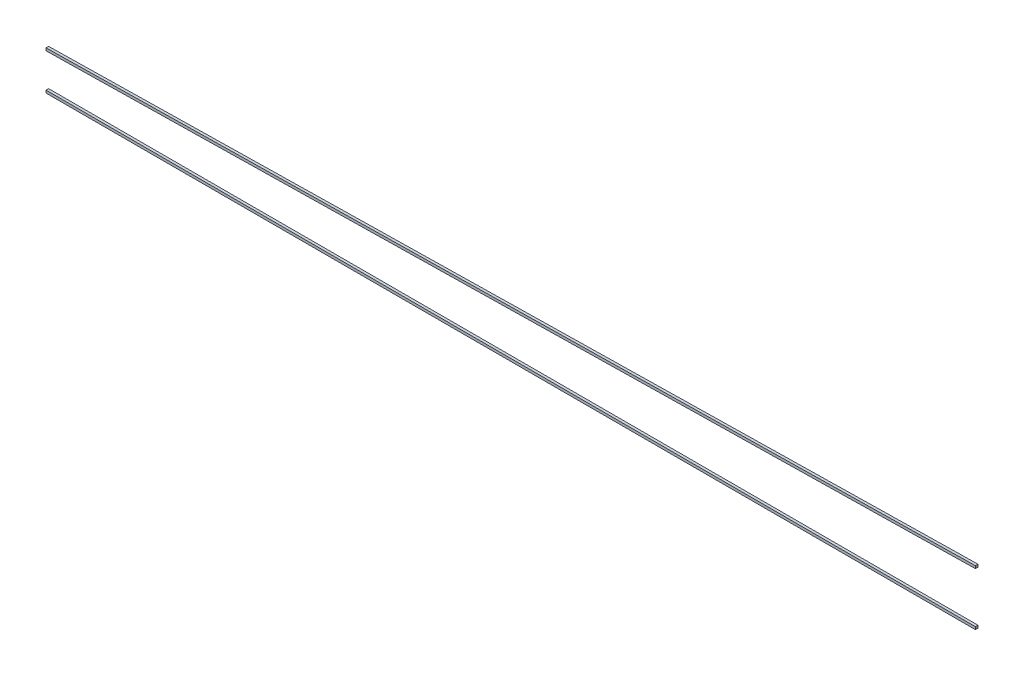
ISO-10303-21;
HEADER;
FILE_DESCRIPTION(('STEP AP214'),'2;1');
FILE_NAME('part.step','',(''),(''),'','','');
FILE_SCHEMA(('AUTOMOTIVE_DESIGN { 1 0 10303 214 1 1 1 1 }'));
ENDSEC;
DATA;
#1=APPLICATION_CONTEXT('core data for automotive mechanical design processes');
#2=APPLICATION_PROTOCOL_DEFINITION('international standard','automotive_design',2000,#1);
#3=PRODUCT_CONTEXT('',#1,'mechanical');
#4=PRODUCT('Part','Part','',(#3));
#5=PRODUCT_RELATED_PRODUCT_CATEGORY('part','',(#4));
#6=PRODUCT_DEFINITION_FORMATION('','',#4);
#7=PRODUCT_DEFINITION_CONTEXT('part definition',#1,'design');
#8=PRODUCT_DEFINITION('design','',#6,#7);
#9=PRODUCT_DEFINITION_SHAPE('','',#8);
#10=(LENGTH_UNIT() NAMED_UNIT(*) SI_UNIT(.MILLI.,.METRE.));
#11=(NAMED_UNIT(*) PLANE_ANGLE_UNIT() SI_UNIT($,.RADIAN.));
#12=(NAMED_UNIT(*) SI_UNIT($,.STERADIAN.) SOLID_ANGLE_UNIT());
#13=UNCERTAINTY_MEASURE_WITH_UNIT(LENGTH_MEASURE(1.E-05),#10,'distance_accuracy_value','');
#14=(GEOMETRIC_REPRESENTATION_CONTEXT(3) GLOBAL_UNCERTAINTY_ASSIGNED_CONTEXT((#13)) GLOBAL_UNIT_ASSIGNED_CONTEXT((#10,
#11,#12)) REPRESENTATION_CONTEXT('',''));
#15=CARTESIAN_POINT('',(0.,0.,0.));
#16=DIRECTION('',(0.,0.,1.));
#17=DIRECTION('',(1.,0.,0.));
#18=AXIS2_PLACEMENT_3D('',#15,#16,#17);
#19=CARTESIAN_POINT('',(271.859441677138,103.463901147709,2.));
#20=DIRECTION('',(1.,0.,0.));
#21=DIRECTION('',(0.,0.,-1.));
#22=AXIS2_PLACEMENT_3D('',#19,#20,#21);
#23=PLANE('',#22);
#24=DIRECTION('',(0.,-1.,0.));
#25=VECTOR('',#24,1.);
#26=CARTESIAN_POINT('',(271.859441677138,103.463901147709,0.));
#27=LINE('',#26,#25);
#28=CARTESIAN_POINT('',(271.859441677138,105.463901147709,0.));
#29=VERTEX_POINT('',#28);
#30=CARTESIAN_POINT('',(271.859441677138,103.463901147709,0.));
#31=VERTEX_POINT('',#30);
#32=EDGE_CURVE('E106',#29,#31,#27,.T.);
#33=ORIENTED_EDGE('',*,*,#32,.T.);
#34=DIRECTION('',(0.,0.,-1.));
#35=VECTOR('',#34,1.);
#36=CARTESIAN_POINT('',(271.859441677138,103.463901147709,2.));
#37=LINE('',#36,#35);
#38=CARTESIAN_POINT('',(271.859441677138,103.463901147709,2.));
#39=VERTEX_POINT('',#38);
#40=EDGE_CURVE('E12',#39,#31,#37,.T.);
#41=ORIENTED_EDGE('',*,*,#40,.F.);
#42=DIRECTION('',(0.,-1.,0.));
#43=VECTOR('',#42,1.);
#44=CARTESIAN_POINT('',(271.859441677138,103.463901147709,2.));
#45=LINE('',#44,#43);
#46=CARTESIAN_POINT('',(271.859441677138,105.463901147709,2.));
#47=VERTEX_POINT('',#46);
#48=EDGE_CURVE('E94',#47,#39,#45,.T.);
#49=ORIENTED_EDGE('',*,*,#48,.F.);
#50=DIRECTION('',(0.,0.,-1.));
#51=VECTOR('',#50,1.);
#52=CARTESIAN_POINT('',(271.859441677138,105.463901147709,2.));
#53=LINE('',#52,#51);
#54=EDGE_CURVE('E102',#47,#29,#53,.T.);
#55=ORIENTED_EDGE('',*,*,#54,.T.);
#56=EDGE_LOOP('',(#33,#41,#49,#55));
#57=FACE_BOUND('',#56,.T.);
#58=ADVANCED_FACE('F43',(#57),#23,.F.);
#59=CARTESIAN_POINT('',(271.859441677138,103.463901147709,2.));
#60=DIRECTION('',(-0.0174524064372835,0.999847695156391,0.));
#61=DIRECTION('',(-0.999847695156391,-0.0174524064372835,0.));
#62=AXIS2_PLACEMENT_3D('',#59,#60,#61);
#63=PLANE('',#62);
#64=DIRECTION('',(0.999847695156391,0.0174524064372835,0.));
#65=VECTOR('',#64,1.);
#66=CARTESIAN_POINT('',(271.859441677138,103.463901147709,0.));
#67=LINE('',#66,#65);
#68=CARTESIAN_POINT('',(990.591041677137,116.00940789167,0.));
#69=VERTEX_POINT('',#68);
#70=EDGE_CURVE('E98',#31,#69,#67,.T.);
#71=ORIENTED_EDGE('',*,*,#70,.T.);
#72=DIRECTION('',(0.,0.,-1.));
#73=VECTOR('',#72,1.);
#74=CARTESIAN_POINT('',(990.591041677137,116.00940789167,2.));
#75=LINE('',#74,#73);
#76=CARTESIAN_POINT('',(990.591041677137,116.00940789167,2.));
#77=VERTEX_POINT('',#76);
#78=EDGE_CURVE('E51',#77,#69,#75,.T.);
#79=ORIENTED_EDGE('',*,*,#78,.F.);
#80=DIRECTION('',(0.999847695156391,0.0174524064372835,0.));
#81=VECTOR('',#80,1.);
#82=CARTESIAN_POINT('',(271.859441677138,103.463901147709,2.));
#83=LINE('',#82,#81);
#84=EDGE_CURVE('E89',#39,#77,#83,.T.);
#85=ORIENTED_EDGE('',*,*,#84,.F.);
#86=ORIENTED_EDGE('',*,*,#40,.T.);
#87=EDGE_LOOP('',(#71,#79,#85,#86));
#88=FACE_BOUND('',#87,.T.);
#89=ADVANCED_FACE('F97',(#88),#63,.F.);
#90=CARTESIAN_POINT('',(990.591041677137,118.00940789167,2.));
#91=DIRECTION('',(-1.,0.,0.));
#92=DIRECTION('',(0.,0.,1.));
#93=AXIS2_PLACEMENT_3D('',#90,#91,#92);
#94=PLANE('',#93);
#95=DIRECTION('',(0.,1.,0.));
#96=VECTOR('',#95,1.);
#97=CARTESIAN_POINT('',(990.591041677137,118.00940789167,0.));
#98=LINE('',#97,#96);
#99=CARTESIAN_POINT('',(990.591041677137,118.00940789167,0.));
#100=VERTEX_POINT('',#99);
#101=EDGE_CURVE('E76',#69,#100,#98,.T.);
#102=ORIENTED_EDGE('',*,*,#101,.T.);
#103=DIRECTION('',(0.,0.,-1.));
#104=VECTOR('',#103,1.);
#105=CARTESIAN_POINT('',(990.591041677137,118.00940789167,2.));
#106=LINE('',#105,#104);
#107=CARTESIAN_POINT('',(990.591041677137,118.00940789167,2.));
#108=VERTEX_POINT('',#107);
#109=EDGE_CURVE('E99',#108,#100,#106,.T.);
#110=ORIENTED_EDGE('',*,*,#109,.F.);
#111=DIRECTION('',(0.,1.,0.));
#112=VECTOR('',#111,1.);
#113=CARTESIAN_POINT('',(990.591041677137,118.00940789167,2.));
#114=LINE('',#113,#112);
#115=EDGE_CURVE('E92',#77,#108,#114,.T.);
#116=ORIENTED_EDGE('',*,*,#115,.F.);
#117=ORIENTED_EDGE('',*,*,#78,.T.);
#118=EDGE_LOOP('',(#102,#110,#116,#117));
#119=FACE_BOUND('',#118,.T.);
#120=ADVANCED_FACE('F100',(#119),#94,.F.);
#121=CARTESIAN_POINT('',(271.859441677138,105.463901147709,2.));
#122=DIRECTION('',(0.0174524064372835,-0.999847695156391,0.));
#123=DIRECTION('',(0.999847695156391,0.0174524064372835,0.));
#124=AXIS2_PLACEMENT_3D('',#121,#122,#123);
#125=PLANE('',#124);
#126=DIRECTION('',(-0.999847695156391,-0.0174524064372835,0.));
#127=VECTOR('',#126,1.);
#128=CARTESIAN_POINT('',(271.859441677138,105.463901147709,0.));
#129=LINE('',#128,#127);
#130=EDGE_CURVE('E82',#100,#29,#129,.T.);
#131=ORIENTED_EDGE('',*,*,#130,.T.);
#132=ORIENTED_EDGE('',*,*,#54,.F.);
#133=DIRECTION('',(-0.999847695156391,-0.0174524064372835,0.));
#134=VECTOR('',#133,1.);
#135=CARTESIAN_POINT('',(271.859441677138,105.463901147709,2.));
#136=LINE('',#135,#134);
#137=EDGE_CURVE('E59',#108,#47,#136,.T.);
#138=ORIENTED_EDGE('',*,*,#137,.F.);
#139=ORIENTED_EDGE('',*,*,#109,.T.);
#140=EDGE_LOOP('',(#131,#132,#138,#139));
#141=FACE_BOUND('',#140,.T.);
#142=ADVANCED_FACE('F113',(#141),#125,.F.);
#143=CARTESIAN_POINT('',(0.,0.,2.));
#144=DIRECTION('',(0.,0.,-1.));
#145=DIRECTION('',(-1.,0.,0.));
#146=AXIS2_PLACEMENT_3D('',#143,#144,#145);
#147=PLANE('',#146);
#148=ORIENTED_EDGE('',*,*,#48,.T.);
#149=ORIENTED_EDGE('',*,*,#84,.T.);
#150=ORIENTED_EDGE('',*,*,#115,.T.);
#151=ORIENTED_EDGE('',*,*,#137,.T.);
#152=EDGE_LOOP('',(#148,#149,#150,#151));
#153=FACE_BOUND('',#152,.T.);
#154=ADVANCED_FACE('F90',(#153),#147,.F.);
#155=CARTESIAN_POINT('',(0.,0.,0.));
#156=DIRECTION('',(0.,0.,-1.));
#157=DIRECTION('',(-1.,0.,0.));
#158=AXIS2_PLACEMENT_3D('',#155,#156,#157);
#159=PLANE('',#158);
#160=ORIENTED_EDGE('',*,*,#32,.F.);
#161=ORIENTED_EDGE('',*,*,#130,.F.);
#162=ORIENTED_EDGE('',*,*,#101,.F.);
#163=ORIENTED_EDGE('',*,*,#70,.F.);
#164=EDGE_LOOP('',(#160,#161,#162,#163));
#165=FACE_BOUND('',#164,.T.);
#166=ADVANCED_FACE('F116',(#165),#159,.T.);
#167=CLOSED_SHELL('',(#58,#89,#120,#142,#154,#166));
#168=MANIFOLD_SOLID_BREP('B2',#167);
#169=CARTESIAN_POINT('',(271.859441677138,75.1616078916704,2.));
#170=DIRECTION('',(1.,0.,0.));
#171=DIRECTION('',(0.,0.,-1.));
#172=AXIS2_PLACEMENT_3D('',#169,#170,#171);
#173=PLANE('',#172);
#174=DIRECTION('',(0.,-1.,0.));
#175=VECTOR('',#174,1.);
#176=CARTESIAN_POINT('',(271.859441677138,75.1616078916704,0.));
#177=LINE('',#176,#175);
#178=CARTESIAN_POINT('',(271.859441677138,77.1616078916704,0.));
#179=VERTEX_POINT('',#178);
#180=CARTESIAN_POINT('',(271.859441677138,75.1616078916704,0.));
#181=VERTEX_POINT('',#180);
#182=EDGE_CURVE('E230',#179,#181,#177,.T.);
#183=ORIENTED_EDGE('',*,*,#182,.T.);
#184=DIRECTION('',(0.,0.,-1.));
#185=VECTOR('',#184,1.);
#186=CARTESIAN_POINT('',(271.859441677138,75.1616078916704,2.));
#187=LINE('',#186,#185);
#188=CARTESIAN_POINT('',(271.859441677138,75.1616078916704,2.));
#189=VERTEX_POINT('',#188);
#190=EDGE_CURVE('E41',#189,#181,#187,.T.);
#191=ORIENTED_EDGE('',*,*,#190,.F.);
#192=DIRECTION('',(0.,-1.,0.));
#193=VECTOR('',#192,1.);
#194=CARTESIAN_POINT('',(271.859441677138,75.1616078916704,2.));
#195=LINE('',#194,#193);
#196=CARTESIAN_POINT('',(271.859441677138,77.1616078916704,2.));
#197=VERTEX_POINT('',#196);
#198=EDGE_CURVE('E218',#197,#189,#195,.T.);
#199=ORIENTED_EDGE('',*,*,#198,.F.);
#200=DIRECTION('',(0.,0.,-1.));
#201=VECTOR('',#200,1.);
#202=CARTESIAN_POINT('',(271.859441677138,77.1616078916704,2.));
#203=LINE('',#202,#201);
#204=EDGE_CURVE('E226',#197,#179,#203,.T.);
#205=ORIENTED_EDGE('',*,*,#204,.T.);
#206=EDGE_LOOP('',(#183,#191,#199,#205));
#207=FACE_BOUND('',#206,.T.);
#208=ADVANCED_FACE('F167',(#207),#173,.F.);
#209=CARTESIAN_POINT('',(271.859441677138,75.1616078916704,2.));
#210=DIRECTION('',(0.,1.,0.));
#211=DIRECTION('',(0.,0.,1.));
#212=AXIS2_PLACEMENT_3D('',#209,#210,#211);
#213=PLANE('',#212);
#214=DIRECTION('',(1.,0.,0.));
#215=VECTOR('',#214,1.);
#216=CARTESIAN_POINT('',(271.859441677138,75.1616078916704,0.));
#217=LINE('',#216,#215);
#218=CARTESIAN_POINT('',(990.591041677137,75.1616078916704,0.));
#219=VERTEX_POINT('',#218);
#220=EDGE_CURVE('E222',#181,#219,#217,.T.);
#221=ORIENTED_EDGE('',*,*,#220,.T.);
#222=DIRECTION('',(0.,0.,-1.));
#223=VECTOR('',#222,1.);
#224=CARTESIAN_POINT('',(990.591041677137,75.1616078916704,2.));
#225=LINE('',#224,#223);
#226=CARTESIAN_POINT('',(990.591041677137,75.1616078916704,2.));
#227=VERTEX_POINT('',#226);
#228=EDGE_CURVE('E175',#227,#219,#225,.T.);
#229=ORIENTED_EDGE('',*,*,#228,.F.);
#230=DIRECTION('',(1.,0.,0.));
#231=VECTOR('',#230,1.);
#232=CARTESIAN_POINT('',(271.859441677138,75.1616078916704,2.));
#233=LINE('',#232,#231);
#234=EDGE_CURVE('E213',#189,#227,#233,.T.);
#235=ORIENTED_EDGE('',*,*,#234,.F.);
#236=ORIENTED_EDGE('',*,*,#190,.T.);
#237=EDGE_LOOP('',(#221,#229,#235,#236));
#238=FACE_BOUND('',#237,.T.);
#239=ADVANCED_FACE('F221',(#238),#213,.F.);
#240=CARTESIAN_POINT('',(990.591041677137,77.1616078916704,2.));
#241=DIRECTION('',(-1.,0.,0.));
#242=DIRECTION('',(0.,0.,1.));
#243=AXIS2_PLACEMENT_3D('',#240,#241,#242);
#244=PLANE('',#243);
#245=DIRECTION('',(0.,1.,0.));
#246=VECTOR('',#245,1.);
#247=CARTESIAN_POINT('',(990.591041677137,77.1616078916704,0.));
#248=LINE('',#247,#246);
#249=CARTESIAN_POINT('',(990.591041677137,77.1616078916704,0.));
#250=VERTEX_POINT('',#249);
#251=EDGE_CURVE('E200',#219,#250,#248,.T.);
#252=ORIENTED_EDGE('',*,*,#251,.T.);
#253=DIRECTION('',(0.,0.,-1.));
#254=VECTOR('',#253,1.);
#255=CARTESIAN_POINT('',(990.591041677137,77.1616078916704,2.));
#256=LINE('',#255,#254);
#257=CARTESIAN_POINT('',(990.591041677137,77.1616078916704,2.));
#258=VERTEX_POINT('',#257);
#259=EDGE_CURVE('E223',#258,#250,#256,.T.);
#260=ORIENTED_EDGE('',*,*,#259,.F.);
#261=DIRECTION('',(0.,1.,0.));
#262=VECTOR('',#261,1.);
#263=CARTESIAN_POINT('',(990.591041677137,77.1616078916704,2.));
#264=LINE('',#263,#262);
#265=EDGE_CURVE('E216',#227,#258,#264,.T.);
#266=ORIENTED_EDGE('',*,*,#265,.F.);
#267=ORIENTED_EDGE('',*,*,#228,.T.);
#268=EDGE_LOOP('',(#252,#260,#266,#267));
#269=FACE_BOUND('',#268,.T.);
#270=ADVANCED_FACE('F224',(#269),#244,.F.);
#271=CARTESIAN_POINT('',(271.859441677138,77.1616078916704,2.));
#272=DIRECTION('',(0.,-1.,0.));
#273=DIRECTION('',(0.,0.,-1.));
#274=AXIS2_PLACEMENT_3D('',#271,#272,#273);
#275=PLANE('',#274);
#276=DIRECTION('',(-1.,0.,0.));
#277=VECTOR('',#276,1.);
#278=CARTESIAN_POINT('',(271.859441677138,77.1616078916704,0.));
#279=LINE('',#278,#277);
#280=EDGE_CURVE('E206',#250,#179,#279,.T.);
#281=ORIENTED_EDGE('',*,*,#280,.T.);
#282=ORIENTED_EDGE('',*,*,#204,.F.);
#283=DIRECTION('',(-1.,0.,0.));
#284=VECTOR('',#283,1.);
#285=CARTESIAN_POINT('',(271.859441677138,77.1616078916704,2.));
#286=LINE('',#285,#284);
#287=EDGE_CURVE('E183',#258,#197,#286,.T.);
#288=ORIENTED_EDGE('',*,*,#287,.F.);
#289=ORIENTED_EDGE('',*,*,#259,.T.);
#290=EDGE_LOOP('',(#281,#282,#288,#289));
#291=FACE_BOUND('',#290,.T.);
#292=ADVANCED_FACE('F237',(#291),#275,.F.);
#293=CARTESIAN_POINT('',(0.,0.,2.));
#294=DIRECTION('',(0.,0.,-1.));
#295=DIRECTION('',(-1.,0.,0.));
#296=AXIS2_PLACEMENT_3D('',#293,#294,#295);
#297=PLANE('',#296);
#298=ORIENTED_EDGE('',*,*,#198,.T.);
#299=ORIENTED_EDGE('',*,*,#234,.T.);
#300=ORIENTED_EDGE('',*,*,#265,.T.);
#301=ORIENTED_EDGE('',*,*,#287,.T.);
#302=EDGE_LOOP('',(#298,#299,#300,#301));
#303=FACE_BOUND('',#302,.T.);
#304=ADVANCED_FACE('F214',(#303),#297,.F.);
#305=CARTESIAN_POINT('',(0.,0.,0.));
#306=DIRECTION('',(0.,0.,-1.));
#307=DIRECTION('',(-1.,0.,0.));
#308=AXIS2_PLACEMENT_3D('',#305,#306,#307);
#309=PLANE('',#308);
#310=ORIENTED_EDGE('',*,*,#182,.F.);
#311=ORIENTED_EDGE('',*,*,#280,.F.);
#312=ORIENTED_EDGE('',*,*,#251,.F.);
#313=ORIENTED_EDGE('',*,*,#220,.F.);
#314=EDGE_LOOP('',(#310,#311,#312,#313));
#315=FACE_BOUND('',#314,.T.);
#316=ADVANCED_FACE('F240',(#315),#309,.T.);
#317=CLOSED_SHELL('',(#208,#239,#270,#292,#304,#316));
#318=MANIFOLD_SOLID_BREP('B6',#317);
#319=ADVANCED_BREP_SHAPE_REPRESENTATION('',(#18,#168,#318),#14);
#320=SHAPE_DEFINITION_REPRESENTATION(#9,#319);
ENDSEC;
END-ISO-10303-21;
